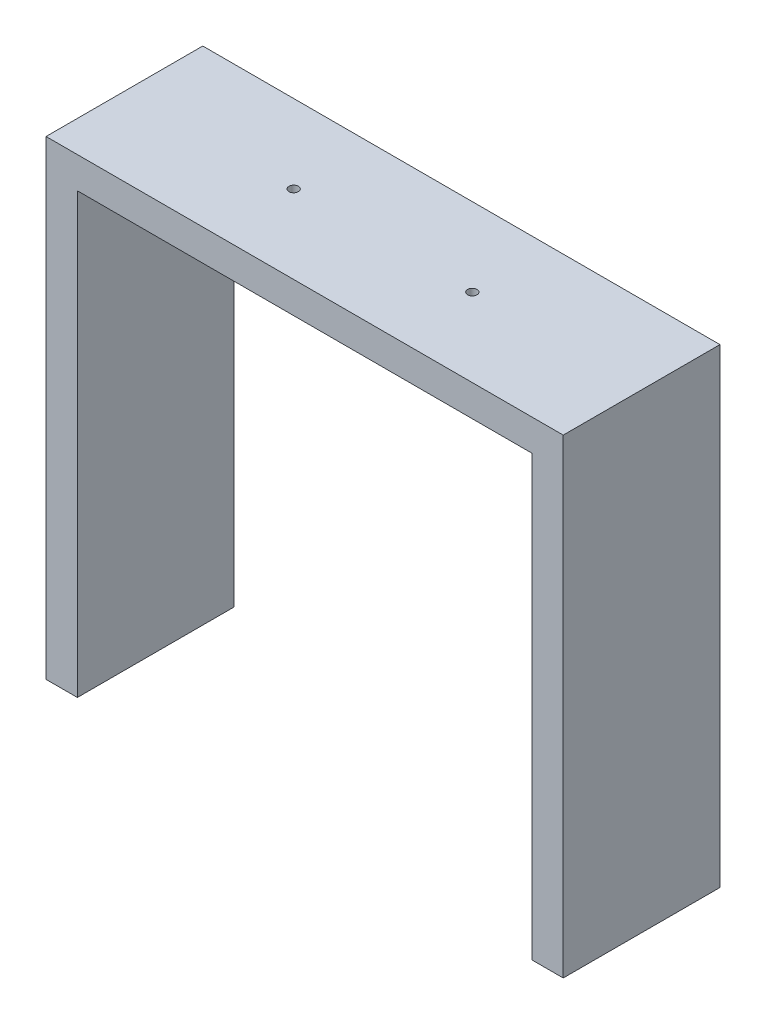
ISO-10303-21;
HEADER;
FILE_DESCRIPTION(('STEP AP214'),'2;1');
FILE_NAME('part.step','',(''),(''),'','','');
FILE_SCHEMA(('AUTOMOTIVE_DESIGN { 1 0 10303 214 1 1 1 1 }'));
ENDSEC;
DATA;
#1=APPLICATION_CONTEXT('core data for automotive mechanical design processes');
#2=APPLICATION_PROTOCOL_DEFINITION('international standard','automotive_design',2000,#1);
#3=PRODUCT_CONTEXT('',#1,'mechanical');
#4=PRODUCT('Part','Part','',(#3));
#5=PRODUCT_RELATED_PRODUCT_CATEGORY('part','',(#4));
#6=PRODUCT_DEFINITION_FORMATION('','',#4);
#7=PRODUCT_DEFINITION_CONTEXT('part definition',#1,'design');
#8=PRODUCT_DEFINITION('design','',#6,#7);
#9=PRODUCT_DEFINITION_SHAPE('','',#8);
#10=(LENGTH_UNIT() NAMED_UNIT(*) SI_UNIT(.MILLI.,.METRE.));
#11=(NAMED_UNIT(*) PLANE_ANGLE_UNIT() SI_UNIT($,.RADIAN.));
#12=(NAMED_UNIT(*) SI_UNIT($,.STERADIAN.) SOLID_ANGLE_UNIT());
#13=UNCERTAINTY_MEASURE_WITH_UNIT(LENGTH_MEASURE(1.E-05),#10,'distance_accuracy_value','');
#14=(GEOMETRIC_REPRESENTATION_CONTEXT(3) GLOBAL_UNCERTAINTY_ASSIGNED_CONTEXT((#13)) GLOBAL_UNIT_ASSIGNED_CONTEXT((#10,
#11,#12)) REPRESENTATION_CONTEXT('',''));
#15=CARTESIAN_POINT('',(0.,0.,0.));
#16=DIRECTION('',(0.,0.,1.));
#17=DIRECTION('',(1.,0.,0.));
#18=AXIS2_PLACEMENT_3D('',#15,#16,#17);
#19=CARTESIAN_POINT('',(-145.,0.,50.));
#20=DIRECTION('',(-1.,0.,0.));
#21=DIRECTION('',(0.,0.,1.));
#22=AXIS2_PLACEMENT_3D('',#19,#20,#21);
#23=PLANE('',#22);
#24=DIRECTION('',(0.,1.,0.));
#25=VECTOR('',#24,1.);
#26=CARTESIAN_POINT('',(-145.,0.,-50.));
#27=LINE('',#26,#25);
#28=CARTESIAN_POINT('',(-145.,0.,-50.));
#29=VERTEX_POINT('',#28);
#30=CARTESIAN_POINT('',(-145.,280.,-50.));
#31=VERTEX_POINT('',#30);
#32=EDGE_CURVE('E141',#29,#31,#27,.T.);
#33=ORIENTED_EDGE('',*,*,#32,.T.);
#34=DIRECTION('',(0.,0.,-1.));
#35=VECTOR('',#34,1.);
#36=CARTESIAN_POINT('',(-145.,280.,50.));
#37=LINE('',#36,#35);
#38=CARTESIAN_POINT('',(-145.,280.,50.));
#39=VERTEX_POINT('',#38);
#40=EDGE_CURVE('E11',#39,#31,#37,.T.);
#41=ORIENTED_EDGE('',*,*,#40,.F.);
#42=DIRECTION('',(0.,1.,0.));
#43=VECTOR('',#42,1.);
#44=CARTESIAN_POINT('',(-145.,0.,50.));
#45=LINE('',#44,#43);
#46=CARTESIAN_POINT('',(-145.,0.,50.));
#47=VERTEX_POINT('',#46);
#48=EDGE_CURVE('E164',#47,#39,#45,.T.);
#49=ORIENTED_EDGE('',*,*,#48,.F.);
#50=DIRECTION('',(0.,0.,-1.));
#51=VECTOR('',#50,1.);
#52=CARTESIAN_POINT('',(-145.,0.,50.));
#53=LINE('',#52,#51);
#54=EDGE_CURVE('E137',#47,#29,#53,.T.);
#55=ORIENTED_EDGE('',*,*,#54,.T.);
#56=EDGE_LOOP('',(#33,#41,#49,#55));
#57=FACE_BOUND('',#56,.T.);
#58=ADVANCED_FACE('F38',(#57),#23,.F.);
#59=CARTESIAN_POINT('',(-145.,280.,50.));
#60=DIRECTION('',(0.,1.,0.));
#61=DIRECTION('',(0.,0.,1.));
#62=AXIS2_PLACEMENT_3D('',#59,#60,#61);
#63=PLANE('',#62);
#64=CARTESIAN_POINT('',(-57.,280.,0.));
#65=DIRECTION('',(0.,1.,0.));
#66=DIRECTION('',(0.,0.,1.));
#67=AXIS2_PLACEMENT_3D('',#64,#65,#66);
#68=CIRCLE('',#67,3.);
#69=CARTESIAN_POINT('',(-57.,280.,3.));
#70=VERTEX_POINT('',#69);
#71=EDGE_CURVE('E194',#70,#70,#68,.T.);
#72=ORIENTED_EDGE('',*,*,#71,.T.);
#73=EDGE_LOOP('',(#72));
#74=FACE_BOUND('',#73,.T.);
#75=CARTESIAN_POINT('',(57.,280.,0.));
#76=DIRECTION('',(0.,1.,0.));
#77=DIRECTION('',(0.,0.,1.));
#78=AXIS2_PLACEMENT_3D('',#75,#76,#77);
#79=CIRCLE('',#78,3.);
#80=CARTESIAN_POINT('',(57.,280.,2.99999999999997));
#81=VERTEX_POINT('',#80);
#82=EDGE_CURVE('E184',#81,#81,#79,.T.);
#83=ORIENTED_EDGE('',*,*,#82,.T.);
#84=EDGE_LOOP('',(#83));
#85=FACE_BOUND('',#84,.T.);
#86=DIRECTION('',(1.,0.,0.));
#87=VECTOR('',#86,1.);
#88=CARTESIAN_POINT('',(-145.,280.,-50.));
#89=LINE('',#88,#87);
#90=CARTESIAN_POINT('',(145.,280.,-50.));
#91=VERTEX_POINT('',#90);
#92=EDGE_CURVE('E145',#31,#91,#89,.T.);
#93=ORIENTED_EDGE('',*,*,#92,.T.);
#94=DIRECTION('',(0.,0.,-1.));
#95=VECTOR('',#94,1.);
#96=CARTESIAN_POINT('',(145.,280.,50.));
#97=LINE('',#96,#95);
#98=CARTESIAN_POINT('',(145.,280.,50.));
#99=VERTEX_POINT('',#98);
#100=EDGE_CURVE('E48',#99,#91,#97,.T.);
#101=ORIENTED_EDGE('',*,*,#100,.F.);
#102=DIRECTION('',(1.,0.,0.));
#103=VECTOR('',#102,1.);
#104=CARTESIAN_POINT('',(-145.,280.,50.));
#105=LINE('',#104,#103);
#106=EDGE_CURVE('E100',#39,#99,#105,.T.);
#107=ORIENTED_EDGE('',*,*,#106,.F.);
#108=ORIENTED_EDGE('',*,*,#40,.T.);
#109=EDGE_LOOP('',(#93,#101,#107,#108));
#110=FACE_BOUND('',#109,.T.);
#111=ADVANCED_FACE('F256',(#74,#85,#110),#63,.F.);
#112=CARTESIAN_POINT('',(145.,280.,50.));
#113=DIRECTION('',(1.,0.,0.));
#114=DIRECTION('',(0.,0.,-1.));
#115=AXIS2_PLACEMENT_3D('',#112,#113,#114);
#116=PLANE('',#115);
#117=DIRECTION('',(0.,-1.,0.));
#118=VECTOR('',#117,1.);
#119=CARTESIAN_POINT('',(145.,280.,-50.));
#120=LINE('',#119,#118);
#121=CARTESIAN_POINT('',(145.,0.,-50.));
#122=VERTEX_POINT('',#121);
#123=EDGE_CURVE('E149',#91,#122,#120,.T.);
#124=ORIENTED_EDGE('',*,*,#123,.T.);
#125=DIRECTION('',(0.,0.,-1.));
#126=VECTOR('',#125,1.);
#127=CARTESIAN_POINT('',(145.,0.,50.));
#128=LINE('',#127,#126);
#129=CARTESIAN_POINT('',(145.,0.,50.));
#130=VERTEX_POINT('',#129);
#131=EDGE_CURVE('E175',#130,#122,#128,.T.);
#132=ORIENTED_EDGE('',*,*,#131,.F.);
#133=DIRECTION('',(0.,-1.,0.));
#134=VECTOR('',#133,1.);
#135=CARTESIAN_POINT('',(145.,280.,50.));
#136=LINE('',#135,#134);
#137=EDGE_CURVE('E218',#99,#130,#136,.T.);
#138=ORIENTED_EDGE('',*,*,#137,.F.);
#139=ORIENTED_EDGE('',*,*,#100,.T.);
#140=EDGE_LOOP('',(#124,#132,#138,#139));
#141=FACE_BOUND('',#140,.T.);
#142=ADVANCED_FACE('F261',(#141),#116,.F.);
#143=CARTESIAN_POINT('',(165.,0.,50.));
#144=DIRECTION('',(0.,1.,0.));
#145=DIRECTION('',(-1.,0.,0.));
#146=AXIS2_PLACEMENT_3D('',#143,#144,#145);
#147=PLANE('',#146);
#148=CARTESIAN_POINT('',(155.,0.,0.));
#149=DIRECTION('',(0.,-1.,0.));
#150=DIRECTION('',(-1.,0.,0.));
#151=AXIS2_PLACEMENT_3D('',#148,#149,#150);
#152=CIRCLE('',#151,3.99999999999999);
#153=CARTESIAN_POINT('',(151.,0.,0.));
#154=VERTEX_POINT('',#153);
#155=EDGE_CURVE('E199',#154,#154,#152,.T.);
#156=ORIENTED_EDGE('',*,*,#155,.F.);
#157=EDGE_LOOP('',(#156));
#158=FACE_BOUND('',#157,.T.);
#159=DIRECTION('',(1.,0.,0.));
#160=VECTOR('',#159,1.);
#161=CARTESIAN_POINT('',(165.,0.,-50.));
#162=LINE('',#161,#160);
#163=CARTESIAN_POINT('',(165.,0.,-50.));
#164=VERTEX_POINT('',#163);
#165=EDGE_CURVE('E152',#122,#164,#162,.T.);
#166=ORIENTED_EDGE('',*,*,#165,.T.);
#167=DIRECTION('',(0.,0.,-1.));
#168=VECTOR('',#167,1.);
#169=CARTESIAN_POINT('',(165.,0.,50.));
#170=LINE('',#169,#168);
#171=CARTESIAN_POINT('',(165.,0.,50.));
#172=VERTEX_POINT('',#171);
#173=EDGE_CURVE('E171',#172,#164,#170,.T.);
#174=ORIENTED_EDGE('',*,*,#173,.F.);
#175=DIRECTION('',(1.,0.,0.));
#176=VECTOR('',#175,1.);
#177=CARTESIAN_POINT('',(165.,0.,50.));
#178=LINE('',#177,#176);
#179=EDGE_CURVE('E221',#130,#172,#178,.T.);
#180=ORIENTED_EDGE('',*,*,#179,.F.);
#181=ORIENTED_EDGE('',*,*,#131,.T.);
#182=EDGE_LOOP('',(#166,#174,#180,#181));
#183=FACE_BOUND('',#182,.T.);
#184=ADVANCED_FACE('F229',(#158,#183),#147,.F.);
#185=CARTESIAN_POINT('',(165.,300.,50.));
#186=DIRECTION('',(-1.,0.,0.));
#187=DIRECTION('',(0.,0.,1.));
#188=AXIS2_PLACEMENT_3D('',#185,#186,#187);
#189=PLANE('',#188);
#190=DIRECTION('',(0.,1.,0.));
#191=VECTOR('',#190,1.);
#192=CARTESIAN_POINT('',(165.,300.,-50.));
#193=LINE('',#192,#191);
#194=CARTESIAN_POINT('',(165.,300.,-50.));
#195=VERTEX_POINT('',#194);
#196=EDGE_CURVE('E155',#164,#195,#193,.T.);
#197=ORIENTED_EDGE('',*,*,#196,.T.);
#198=DIRECTION('',(0.,0.,-1.));
#199=VECTOR('',#198,1.);
#200=CARTESIAN_POINT('',(165.,300.,50.));
#201=LINE('',#200,#199);
#202=CARTESIAN_POINT('',(165.,300.,50.));
#203=VERTEX_POINT('',#202);
#204=EDGE_CURVE('E130',#203,#195,#201,.T.);
#205=ORIENTED_EDGE('',*,*,#204,.F.);
#206=DIRECTION('',(0.,1.,0.));
#207=VECTOR('',#206,1.);
#208=CARTESIAN_POINT('',(165.,300.,50.));
#209=LINE('',#208,#207);
#210=EDGE_CURVE('E119',#172,#203,#209,.T.);
#211=ORIENTED_EDGE('',*,*,#210,.F.);
#212=ORIENTED_EDGE('',*,*,#173,.T.);
#213=EDGE_LOOP('',(#197,#205,#211,#212));
#214=FACE_BOUND('',#213,.T.);
#215=ADVANCED_FACE('F233',(#214),#189,.F.);
#216=CARTESIAN_POINT('',(-165.,300.,50.));
#217=DIRECTION('',(0.,-1.,0.));
#218=DIRECTION('',(0.,0.,-1.));
#219=AXIS2_PLACEMENT_3D('',#216,#217,#218);
#220=PLANE('',#219);
#221=CARTESIAN_POINT('',(-57.,300.,0.));
#222=DIRECTION('',(0.,-1.,0.));
#223=DIRECTION('',(0.,0.,-1.));
#224=AXIS2_PLACEMENT_3D('',#221,#222,#223);
#225=CIRCLE('',#224,3.);
#226=CARTESIAN_POINT('',(-57.,300.,-3.));
#227=VERTEX_POINT('',#226);
#228=EDGE_CURVE('E41',#227,#227,#225,.T.);
#229=ORIENTED_EDGE('',*,*,#228,.T.);
#230=EDGE_LOOP('',(#229));
#231=FACE_BOUND('',#230,.T.);
#232=CARTESIAN_POINT('',(57.,300.,0.));
#233=DIRECTION('',(0.,-1.,0.));
#234=DIRECTION('',(0.,0.,-1.));
#235=AXIS2_PLACEMENT_3D('',#232,#233,#234);
#236=CIRCLE('',#235,3.);
#237=CARTESIAN_POINT('',(57.,300.,-3.00000000000002));
#238=VERTEX_POINT('',#237);
#239=EDGE_CURVE('E181',#238,#238,#236,.T.);
#240=ORIENTED_EDGE('',*,*,#239,.T.);
#241=EDGE_LOOP('',(#240));
#242=FACE_BOUND('',#241,.T.);
#243=DIRECTION('',(-1.,0.,0.));
#244=VECTOR('',#243,1.);
#245=CARTESIAN_POINT('',(-165.,300.,-50.));
#246=LINE('',#245,#244);
#247=CARTESIAN_POINT('',(-165.,300.,-50.));
#248=VERTEX_POINT('',#247);
#249=EDGE_CURVE('E128',#195,#248,#246,.T.);
#250=ORIENTED_EDGE('',*,*,#249,.T.);
#251=DIRECTION('',(0.,0.,-1.));
#252=VECTOR('',#251,1.);
#253=CARTESIAN_POINT('',(-165.,300.,50.));
#254=LINE('',#253,#252);
#255=CARTESIAN_POINT('',(-165.,300.,50.));
#256=VERTEX_POINT('',#255);
#257=EDGE_CURVE('E125',#256,#248,#254,.T.);
#258=ORIENTED_EDGE('',*,*,#257,.F.);
#259=DIRECTION('',(-1.,0.,0.));
#260=VECTOR('',#259,1.);
#261=CARTESIAN_POINT('',(-165.,300.,50.));
#262=LINE('',#261,#260);
#263=EDGE_CURVE('E113',#203,#256,#262,.T.);
#264=ORIENTED_EDGE('',*,*,#263,.F.);
#265=ORIENTED_EDGE('',*,*,#204,.T.);
#266=EDGE_LOOP('',(#250,#258,#264,#265));
#267=FACE_BOUND('',#266,.T.);
#268=ADVANCED_FACE('F126',(#231,#242,#267),#220,.F.);
#269=CARTESIAN_POINT('',(-165.,0.,50.));
#270=DIRECTION('',(1.,0.,0.));
#271=DIRECTION('',(0.,0.,-1.));
#272=AXIS2_PLACEMENT_3D('',#269,#270,#271);
#273=PLANE('',#272);
#274=DIRECTION('',(0.,-1.,0.));
#275=VECTOR('',#274,1.);
#276=CARTESIAN_POINT('',(-165.,0.,-50.));
#277=LINE('',#276,#275);
#278=CARTESIAN_POINT('',(-165.,0.,-50.));
#279=VERTEX_POINT('',#278);
#280=EDGE_CURVE('E86',#248,#279,#277,.T.);
#281=ORIENTED_EDGE('',*,*,#280,.T.);
#282=DIRECTION('',(0.,0.,-1.));
#283=VECTOR('',#282,1.);
#284=CARTESIAN_POINT('',(-165.,0.,50.));
#285=LINE('',#284,#283);
#286=CARTESIAN_POINT('',(-165.,0.,50.));
#287=VERTEX_POINT('',#286);
#288=EDGE_CURVE('E131',#287,#279,#285,.T.);
#289=ORIENTED_EDGE('',*,*,#288,.F.);
#290=DIRECTION('',(0.,-1.,0.));
#291=VECTOR('',#290,1.);
#292=CARTESIAN_POINT('',(-165.,0.,50.));
#293=LINE('',#292,#291);
#294=EDGE_CURVE('E117',#256,#287,#293,.T.);
#295=ORIENTED_EDGE('',*,*,#294,.F.);
#296=ORIENTED_EDGE('',*,*,#257,.T.);
#297=EDGE_LOOP('',(#281,#289,#295,#296));
#298=FACE_BOUND('',#297,.T.);
#299=ADVANCED_FACE('F133',(#298),#273,.F.);
#300=CARTESIAN_POINT('',(-165.,0.,50.));
#301=DIRECTION('',(0.,1.,0.));
#302=DIRECTION('',(-1.,0.,0.));
#303=AXIS2_PLACEMENT_3D('',#300,#301,#302);
#304=PLANE('',#303);
#305=CARTESIAN_POINT('',(-155.,0.,0.));
#306=DIRECTION('',(0.,-1.,0.));
#307=DIRECTION('',(1.,0.,0.));
#308=AXIS2_PLACEMENT_3D('',#305,#306,#307);
#309=CIRCLE('',#308,3.99999999999999);
#310=CARTESIAN_POINT('',(-151.,0.,0.));
#311=VERTEX_POINT('',#310);
#312=EDGE_CURVE('E203',#311,#311,#309,.T.);
#313=ORIENTED_EDGE('',*,*,#312,.F.);
#314=EDGE_LOOP('',(#313));
#315=FACE_BOUND('',#314,.T.);
#316=DIRECTION('',(1.,0.,0.));
#317=VECTOR('',#316,1.);
#318=CARTESIAN_POINT('',(-165.,0.,-50.));
#319=LINE('',#318,#317);
#320=EDGE_CURVE('E92',#279,#29,#319,.T.);
#321=ORIENTED_EDGE('',*,*,#320,.T.);
#322=ORIENTED_EDGE('',*,*,#54,.F.);
#323=DIRECTION('',(1.,0.,0.));
#324=VECTOR('',#323,1.);
#325=CARTESIAN_POINT('',(-165.,0.,50.));
#326=LINE('',#325,#324);
#327=EDGE_CURVE('E57',#287,#47,#326,.T.);
#328=ORIENTED_EDGE('',*,*,#327,.F.);
#329=ORIENTED_EDGE('',*,*,#288,.T.);
#330=EDGE_LOOP('',(#321,#322,#328,#329));
#331=FACE_BOUND('',#330,.T.);
#332=ADVANCED_FACE('F241',(#315,#331),#304,.F.);
#333=CARTESIAN_POINT('',(0.,0.,50.));
#334=DIRECTION('',(0.,0.,-1.));
#335=DIRECTION('',(-1.,0.,0.));
#336=AXIS2_PLACEMENT_3D('',#333,#334,#335);
#337=PLANE('',#336);
#338=ORIENTED_EDGE('',*,*,#48,.T.);
#339=ORIENTED_EDGE('',*,*,#106,.T.);
#340=ORIENTED_EDGE('',*,*,#137,.T.);
#341=ORIENTED_EDGE('',*,*,#179,.T.);
#342=ORIENTED_EDGE('',*,*,#210,.T.);
#343=ORIENTED_EDGE('',*,*,#263,.T.);
#344=ORIENTED_EDGE('',*,*,#294,.T.);
#345=ORIENTED_EDGE('',*,*,#327,.T.);
#346=EDGE_LOOP('',(#338,#339,#340,#341,#342,#343,#344,#345));
#347=FACE_BOUND('',#346,.T.);
#348=ADVANCED_FACE('F115',(#347),#337,.F.);
#349=CARTESIAN_POINT('',(0.,0.,-50.));
#350=DIRECTION('',(0.,0.,-1.));
#351=DIRECTION('',(-1.,0.,0.));
#352=AXIS2_PLACEMENT_3D('',#349,#350,#351);
#353=PLANE('',#352);
#354=ORIENTED_EDGE('',*,*,#32,.F.);
#355=ORIENTED_EDGE('',*,*,#320,.F.);
#356=ORIENTED_EDGE('',*,*,#280,.F.);
#357=ORIENTED_EDGE('',*,*,#249,.F.);
#358=ORIENTED_EDGE('',*,*,#196,.F.);
#359=ORIENTED_EDGE('',*,*,#165,.F.);
#360=ORIENTED_EDGE('',*,*,#123,.F.);
#361=ORIENTED_EDGE('',*,*,#92,.F.);
#362=EDGE_LOOP('',(#354,#355,#356,#357,#358,#359,#360,#361));
#363=FACE_BOUND('',#362,.T.);
#364=ADVANCED_FACE('F236',(#363),#353,.T.);
#365=CARTESIAN_POINT('',(-155.,50.,0.));
#366=DIRECTION('',(0.,-1.,0.));
#367=DIRECTION('',(1.,0.,0.));
#368=AXIS2_PLACEMENT_3D('',#365,#366,#367);
#369=CYLINDRICAL_SURFACE('',#368,3.99999999999999);
#370=CARTESIAN_POINT('',(-155.,50.,0.));
#371=DIRECTION('',(0.,-1.,0.));
#372=DIRECTION('',(1.,0.,0.));
#373=AXIS2_PLACEMENT_3D('',#370,#371,#372);
#374=CIRCLE('',#373,3.99999999999999);
#375=CARTESIAN_POINT('',(-151.,50.,0.));
#376=VERTEX_POINT('',#375);
#377=EDGE_CURVE('E146',#376,#376,#374,.T.);
#378=ORIENTED_EDGE('',*,*,#377,.F.);
#379=EDGE_LOOP('',(#378));
#380=FACE_BOUND('',#379,.T.);
#381=ORIENTED_EDGE('',*,*,#312,.T.);
#382=EDGE_LOOP('',(#381));
#383=FACE_BOUND('',#382,.T.);
#384=ADVANCED_FACE('F297',(#380,#383),#369,.F.);
#385=CARTESIAN_POINT('',(-155.,50.,0.));
#386=DIRECTION('',(0.,-1.,0.));
#387=DIRECTION('',(1.,0.,0.));
#388=AXIS2_PLACEMENT_3D('',#385,#386,#387);
#389=PLANE('',#388);
#390=ORIENTED_EDGE('',*,*,#377,.T.);
#391=EDGE_LOOP('',(#390));
#392=FACE_BOUND('',#391,.T.);
#393=ADVANCED_FACE('F293',(#392),#389,.T.);
#394=CARTESIAN_POINT('',(155.,50.,0.));
#395=DIRECTION('',(0.,-1.,0.));
#396=DIRECTION('',(1.,0.,0.));
#397=AXIS2_PLACEMENT_3D('',#394,#395,#396);
#398=CYLINDRICAL_SURFACE('',#397,3.99999999999999);
#399=CARTESIAN_POINT('',(155.,50.,0.));
#400=DIRECTION('',(0.,-1.,0.));
#401=DIRECTION('',(-1.,0.,0.));
#402=AXIS2_PLACEMENT_3D('',#399,#400,#401);
#403=CIRCLE('',#402,3.99999999999999);
#404=CARTESIAN_POINT('',(151.,50.,0.));
#405=VERTEX_POINT('',#404);
#406=EDGE_CURVE('E207',#405,#405,#403,.T.);
#407=ORIENTED_EDGE('',*,*,#406,.F.);
#408=EDGE_LOOP('',(#407));
#409=FACE_BOUND('',#408,.T.);
#410=ORIENTED_EDGE('',*,*,#155,.T.);
#411=EDGE_LOOP('',(#410));
#412=FACE_BOUND('',#411,.T.);
#413=ADVANCED_FACE('F296',(#409,#412),#398,.F.);
#414=CARTESIAN_POINT('',(155.,50.,0.));
#415=DIRECTION('',(0.,1.,0.));
#416=DIRECTION('',(-1.,0.,0.));
#417=AXIS2_PLACEMENT_3D('',#414,#415,#416);
#418=PLANE('',#417);
#419=ORIENTED_EDGE('',*,*,#406,.T.);
#420=EDGE_LOOP('',(#419));
#421=FACE_BOUND('',#420,.T.);
#422=ADVANCED_FACE('F289',(#421),#418,.F.);
#423=CARTESIAN_POINT('',(57.,0.,0.));
#424=DIRECTION('',(0.,1.,0.));
#425=DIRECTION('',(0.,0.,1.));
#426=AXIS2_PLACEMENT_3D('',#423,#424,#425);
#427=CYLINDRICAL_SURFACE('',#426,3.);
#428=ORIENTED_EDGE('',*,*,#239,.F.);
#429=EDGE_LOOP('',(#428));
#430=FACE_BOUND('',#429,.T.);
#431=ORIENTED_EDGE('',*,*,#82,.F.);
#432=EDGE_LOOP('',(#431));
#433=FACE_BOUND('',#432,.T.);
#434=ADVANCED_FACE('F283',(#430,#433),#427,.F.);
#435=CARTESIAN_POINT('',(-57.,0.,0.));
#436=DIRECTION('',(0.,1.,0.));
#437=DIRECTION('',(0.,0.,1.));
#438=AXIS2_PLACEMENT_3D('',#435,#436,#437);
#439=CYLINDRICAL_SURFACE('',#438,3.);
#440=ORIENTED_EDGE('',*,*,#228,.F.);
#441=EDGE_LOOP('',(#440));
#442=FACE_BOUND('',#441,.T.);
#443=ORIENTED_EDGE('',*,*,#71,.F.);
#444=EDGE_LOOP('',(#443));
#445=FACE_BOUND('',#444,.T.);
#446=ADVANCED_FACE('F280',(#442,#445),#439,.F.);
#447=CLOSED_SHELL('',(#58,#111,#142,#184,#215,#268,#299,#332,#348,#364,#384,#393,#413,#422,#434,#446));
#448=MANIFOLD_SOLID_BREP('B2',#447);
#449=ADVANCED_BREP_SHAPE_REPRESENTATION('',(#18,#448),#14);
#450=SHAPE_DEFINITION_REPRESENTATION(#9,#449);
ENDSEC;
END-ISO-10303-21;
